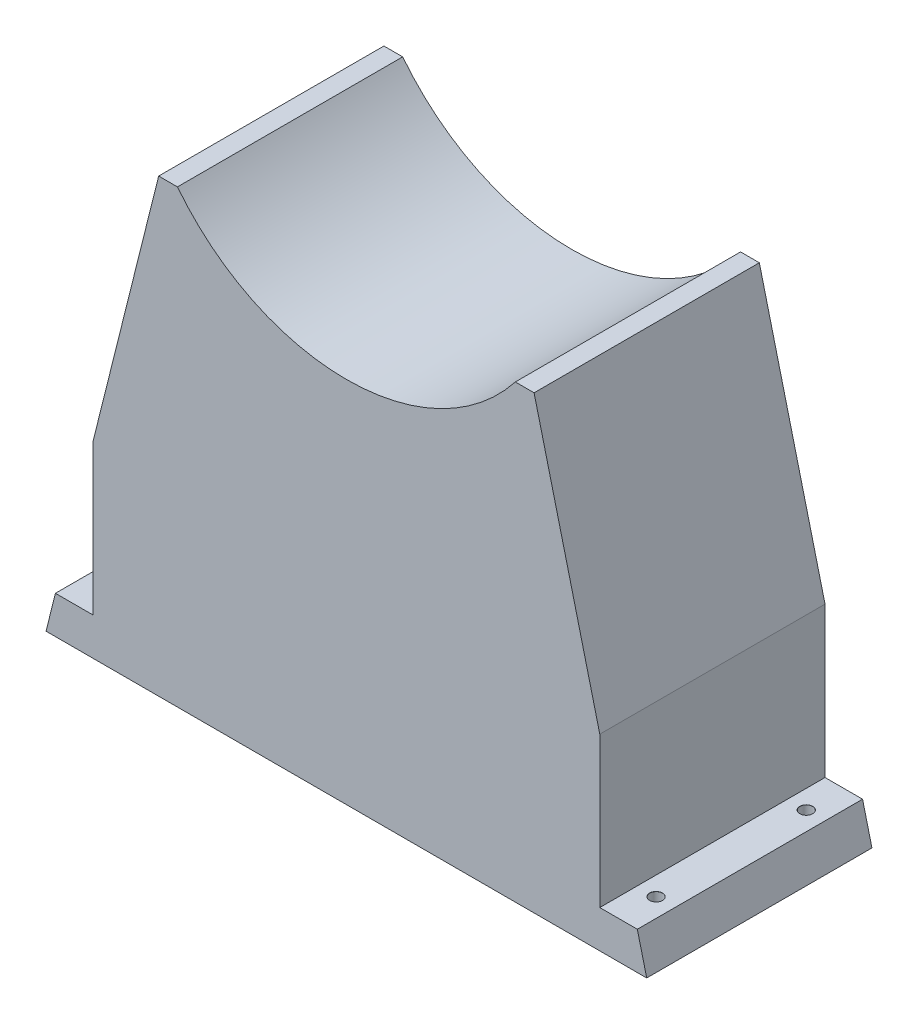
ISO-10303-21;
HEADER;
FILE_DESCRIPTION(('STEP AP214'),'2;1');
FILE_NAME('part.step','',(''),(''),'','','');
FILE_SCHEMA(('AUTOMOTIVE_DESIGN { 1 0 10303 214 1 1 1 1 }'));
ENDSEC;
DATA;
#1=APPLICATION_CONTEXT('core data for automotive mechanical design processes');
#2=APPLICATION_PROTOCOL_DEFINITION('international standard','automotive_design',2000,#1);
#3=PRODUCT_CONTEXT('',#1,'mechanical');
#4=PRODUCT('Part','Part','',(#3));
#5=PRODUCT_RELATED_PRODUCT_CATEGORY('part','',(#4));
#6=PRODUCT_DEFINITION_FORMATION('','',#4);
#7=PRODUCT_DEFINITION_CONTEXT('part definition',#1,'design');
#8=PRODUCT_DEFINITION('design','',#6,#7);
#9=PRODUCT_DEFINITION_SHAPE('','',#8);
#10=(LENGTH_UNIT() NAMED_UNIT(*) SI_UNIT(.MILLI.,.METRE.));
#11=(NAMED_UNIT(*) PLANE_ANGLE_UNIT() SI_UNIT($,.RADIAN.));
#12=(NAMED_UNIT(*) SI_UNIT($,.STERADIAN.) SOLID_ANGLE_UNIT());
#13=UNCERTAINTY_MEASURE_WITH_UNIT(LENGTH_MEASURE(1.E-05),#10,'distance_accuracy_value','');
#14=(GEOMETRIC_REPRESENTATION_CONTEXT(3) GLOBAL_UNCERTAINTY_ASSIGNED_CONTEXT((#13)) GLOBAL_UNIT_ASSIGNED_CONTEXT((#10,
#11,#12)) REPRESENTATION_CONTEXT('',''));
#15=CARTESIAN_POINT('',(0.,0.,0.));
#16=DIRECTION('',(0.,0.,1.));
#17=DIRECTION('',(1.,0.,0.));
#18=AXIS2_PLACEMENT_3D('',#15,#16,#17);
#19=CARTESIAN_POINT('',(152.5,9.99999999999995,50.));
#20=DIRECTION('',(0.,1.,0.));
#21=DIRECTION('',(0.,0.,1.));
#22=AXIS2_PLACEMENT_3D('',#19,#20,#21);
#23=CYLINDRICAL_SURFACE('',#22,1.69999999999998);
#24=CARTESIAN_POINT('',(152.5,9.97124078981942,50.));
#25=DIRECTION('',(0.,1.,0.));
#26=DIRECTION('',(0.,0.,1.));
#27=AXIS2_PLACEMENT_3D('',#24,#25,#26);
#28=CIRCLE('',#27,1.69999999999998);
#29=CARTESIAN_POINT('',(152.5,9.97124078981942,51.7));
#30=VERTEX_POINT('',#29);
#31=EDGE_CURVE('E241',#30,#30,#28,.T.);
#32=ORIENTED_EDGE('',*,*,#31,.T.);
#33=EDGE_LOOP('',(#32));
#34=FACE_BOUND('',#33,.T.);
#35=CARTESIAN_POINT('',(152.5,5.00000000000003,50.));
#36=DIRECTION('',(0.,-1.,0.));
#37=DIRECTION('',(1.,0.,0.));
#38=AXIS2_PLACEMENT_3D('',#35,#36,#37);
#39=CIRCLE('',#38,1.69999999999998);
#40=CARTESIAN_POINT('',(154.2,5.00000000000003,50.));
#41=VERTEX_POINT('',#40);
#42=EDGE_CURVE('E46',#41,#41,#39,.F.);
#43=ORIENTED_EDGE('',*,*,#42,.F.);
#44=EDGE_LOOP('',(#43));
#45=FACE_BOUND('',#44,.T.);
#46=ADVANCED_FACE('F42',(#34,#45),#23,.F.);
#47=CARTESIAN_POINT('',(152.5,9.99999999999995,10.));
#48=DIRECTION('',(0.,1.,0.));
#49=DIRECTION('',(0.,0.,1.));
#50=AXIS2_PLACEMENT_3D('',#47,#48,#49);
#51=CYLINDRICAL_SURFACE('',#50,1.69999999999998);
#52=CARTESIAN_POINT('',(152.5,9.97124078981942,10.));
#53=DIRECTION('',(0.,1.,0.));
#54=DIRECTION('',(0.,0.,1.));
#55=AXIS2_PLACEMENT_3D('',#52,#53,#54);
#56=CIRCLE('',#55,1.69999999999998);
#57=CARTESIAN_POINT('',(152.5,9.97124078981942,11.7));
#58=VERTEX_POINT('',#57);
#59=EDGE_CURVE('E233',#58,#58,#56,.T.);
#60=ORIENTED_EDGE('',*,*,#59,.T.);
#61=EDGE_LOOP('',(#60));
#62=FACE_BOUND('',#61,.T.);
#63=CARTESIAN_POINT('',(152.5,5.00000000000003,10.));
#64=DIRECTION('',(0.,-1.,0.));
#65=DIRECTION('',(1.,0.,0.));
#66=AXIS2_PLACEMENT_3D('',#63,#64,#65);
#67=CIRCLE('',#66,1.69999999999998);
#68=CARTESIAN_POINT('',(154.2,5.00000000000003,10.));
#69=VERTEX_POINT('',#68);
#70=EDGE_CURVE('E198',#69,#69,#67,.F.);
#71=ORIENTED_EDGE('',*,*,#70,.F.);
#72=EDGE_LOOP('',(#71));
#73=FACE_BOUND('',#72,.T.);
#74=ADVANCED_FACE('F363',(#62,#73),#51,.F.);
#75=CARTESIAN_POINT('',(7.5,10.,50.));
#76=DIRECTION('',(0.,1.,0.));
#77=DIRECTION('',(0.,0.,1.));
#78=AXIS2_PLACEMENT_3D('',#75,#76,#77);
#79=CYLINDRICAL_SURFACE('',#78,1.69999999999999);
#80=CARTESIAN_POINT('',(7.5,9.97124078981947,50.));
#81=DIRECTION('',(0.,1.,0.));
#82=DIRECTION('',(0.,0.,1.));
#83=AXIS2_PLACEMENT_3D('',#80,#81,#82);
#84=CIRCLE('',#83,1.69999999999999);
#85=CARTESIAN_POINT('',(7.5,9.97124078981947,51.7));
#86=VERTEX_POINT('',#85);
#87=EDGE_CURVE('E225',#86,#86,#84,.T.);
#88=ORIENTED_EDGE('',*,*,#87,.T.);
#89=EDGE_LOOP('',(#88));
#90=FACE_BOUND('',#89,.T.);
#91=CARTESIAN_POINT('',(7.5,5.,50.));
#92=DIRECTION('',(0.,-1.,0.));
#93=DIRECTION('',(1.,0.,0.));
#94=AXIS2_PLACEMENT_3D('',#91,#92,#93);
#95=CIRCLE('',#94,1.69999999999999);
#96=CARTESIAN_POINT('',(9.19999999999999,5.,50.));
#97=VERTEX_POINT('',#96);
#98=EDGE_CURVE('E194',#97,#97,#95,.F.);
#99=ORIENTED_EDGE('',*,*,#98,.F.);
#100=EDGE_LOOP('',(#99));
#101=FACE_BOUND('',#100,.T.);
#102=ADVANCED_FACE('F370',(#90,#101),#79,.F.);
#103=CARTESIAN_POINT('',(7.5,10.,10.));
#104=DIRECTION('',(0.,1.,0.));
#105=DIRECTION('',(0.,0.,1.));
#106=AXIS2_PLACEMENT_3D('',#103,#104,#105);
#107=CYLINDRICAL_SURFACE('',#106,1.69999999999999);
#108=CARTESIAN_POINT('',(7.5,9.97124078981947,10.));
#109=DIRECTION('',(0.,1.,0.));
#110=DIRECTION('',(0.,0.,1.));
#111=AXIS2_PLACEMENT_3D('',#108,#109,#110);
#112=CIRCLE('',#111,1.69999999999999);
#113=CARTESIAN_POINT('',(7.5,9.97124078981947,11.7));
#114=VERTEX_POINT('',#113);
#115=EDGE_CURVE('E210',#114,#114,#112,.T.);
#116=ORIENTED_EDGE('',*,*,#115,.T.);
#117=EDGE_LOOP('',(#116));
#118=FACE_BOUND('',#117,.T.);
#119=CARTESIAN_POINT('',(7.5,5.,10.));
#120=DIRECTION('',(0.,-1.,0.));
#121=DIRECTION('',(1.,0.,0.));
#122=AXIS2_PLACEMENT_3D('',#119,#120,#121);
#123=CIRCLE('',#122,1.69999999999999);
#124=CARTESIAN_POINT('',(9.19999999999999,5.,10.));
#125=VERTEX_POINT('',#124);
#126=EDGE_CURVE('E190',#125,#125,#123,.F.);
#127=ORIENTED_EDGE('',*,*,#126,.F.);
#128=EDGE_LOOP('',(#127));
#129=FACE_BOUND('',#128,.T.);
#130=ADVANCED_FACE('F444',(#118,#129),#107,.F.);
#131=CARTESIAN_POINT('',(130.,120.,60.));
#132=DIRECTION('',(-0.970142500145332,-0.242535625036333,0.));
#133=DIRECTION('',(0.242535625036333,-0.970142500145332,0.));
#134=AXIS2_PLACEMENT_3D('',#131,#132,#133);
#135=PLANE('',#134);
#136=DIRECTION('',(-0.242535625036333,0.970142500145332,0.));
#137=VECTOR('',#136,1.);
#138=CARTESIAN_POINT('',(130.,120.,0.));
#139=LINE('',#138,#137);
#140=CARTESIAN_POINT('',(160.,0.,0.));
#141=VERTEX_POINT('',#140);
#142=CARTESIAN_POINT('',(157.5,10.0000000000001,0.));
#143=VERTEX_POINT('',#142);
#144=EDGE_CURVE('E302',#141,#143,#139,.T.);
#145=ORIENTED_EDGE('',*,*,#144,.T.);
#146=DIRECTION('',(0.,0.,1.));
#147=VECTOR('',#146,1.);
#148=CARTESIAN_POINT('',(157.5,10.0000000000001,-0.001000000000001));
#149=LINE('',#148,#147);
#150=CARTESIAN_POINT('',(157.5,10.0000000000001,60.));
#151=VERTEX_POINT('',#150);
#152=EDGE_CURVE('E260',#143,#151,#149,.T.);
#153=ORIENTED_EDGE('',*,*,#152,.T.);
#154=DIRECTION('',(-0.242535625036333,0.970142500145332,0.));
#155=VECTOR('',#154,1.);
#156=CARTESIAN_POINT('',(130.,120.,60.));
#157=LINE('',#156,#155);
#158=CARTESIAN_POINT('',(160.,0.,60.));
#159=VERTEX_POINT('',#158);
#160=EDGE_CURVE('E283',#159,#151,#157,.T.);
#161=ORIENTED_EDGE('',*,*,#160,.F.);
#162=DIRECTION('',(0.,0.,-1.));
#163=VECTOR('',#162,1.);
#164=CARTESIAN_POINT('',(160.,0.,60.));
#165=LINE('',#164,#163);
#166=EDGE_CURVE('E11',#159,#141,#165,.T.);
#167=ORIENTED_EDGE('',*,*,#166,.T.);
#168=EDGE_LOOP('',(#145,#153,#161,#167));
#169=FACE_BOUND('',#168,.T.);
#170=ADVANCED_FACE('F345',(#169),#135,.F.);
#171=CARTESIAN_POINT('',(0.,0.,60.));
#172=DIRECTION('',(0.970142500145332,-0.242535625036333,0.));
#173=DIRECTION('',(0.242535625036333,0.970142500145332,0.));
#174=AXIS2_PLACEMENT_3D('',#171,#172,#173);
#175=PLANE('',#174);
#176=DIRECTION('',(-0.242535625036333,-0.970142500145332,0.));
#177=VECTOR('',#176,1.);
#178=CARTESIAN_POINT('',(0.,0.,0.));
#179=LINE('',#178,#177);
#180=CARTESIAN_POINT('',(30.,120.,0.));
#181=VERTEX_POINT('',#180);
#182=CARTESIAN_POINT('',(12.5,50.,0.));
#183=VERTEX_POINT('',#182);
#184=EDGE_CURVE('E160',#181,#183,#179,.T.);
#185=ORIENTED_EDGE('',*,*,#184,.T.);
#186=DIRECTION('',(0.,0.,1.));
#187=VECTOR('',#186,1.);
#188=CARTESIAN_POINT('',(12.5,50.,-0.001000000000001));
#189=LINE('',#188,#187);
#190=CARTESIAN_POINT('',(12.5,50.,60.));
#191=VERTEX_POINT('',#190);
#192=EDGE_CURVE('E144',#183,#191,#189,.T.);
#193=ORIENTED_EDGE('',*,*,#192,.T.);
#194=DIRECTION('',(-0.242535625036333,-0.970142500145332,0.));
#195=VECTOR('',#194,1.);
#196=CARTESIAN_POINT('',(0.,0.,60.));
#197=LINE('',#196,#195);
#198=CARTESIAN_POINT('',(30.,120.,60.));
#199=VERTEX_POINT('',#198);
#200=EDGE_CURVE('E175',#199,#191,#197,.T.);
#201=ORIENTED_EDGE('',*,*,#200,.F.);
#202=DIRECTION('',(0.,0.,-1.));
#203=VECTOR('',#202,1.);
#204=CARTESIAN_POINT('',(30.,120.,60.));
#205=LINE('',#204,#203);
#206=EDGE_CURVE('E174',#199,#181,#205,.T.);
#207=ORIENTED_EDGE('',*,*,#206,.T.);
#208=EDGE_LOOP('',(#185,#193,#201,#207));
#209=FACE_BOUND('',#208,.T.);
#210=ADVANCED_FACE('F323',(#209),#175,.F.);
#211=CARTESIAN_POINT('',(160.,0.,60.));
#212=DIRECTION('',(0.,1.,0.));
#213=DIRECTION('',(-1.,0.,0.));
#214=AXIS2_PLACEMENT_3D('',#211,#212,#213);
#215=PLANE('',#214);
#216=CARTESIAN_POINT('',(152.5,0.,50.));
#217=DIRECTION('',(0.,-1.,0.));
#218=DIRECTION('',(1.,0.,0.));
#219=AXIS2_PLACEMENT_3D('',#216,#217,#218);
#220=CIRCLE('',#219,3.25000000000001);
#221=CARTESIAN_POINT('',(155.75,0.,50.));
#222=VERTEX_POINT('',#221);
#223=EDGE_CURVE('E661',#222,#222,#220,.T.);
#224=ORIENTED_EDGE('',*,*,#223,.F.);
#225=EDGE_LOOP('',(#224));
#226=FACE_BOUND('',#225,.T.);
#227=CARTESIAN_POINT('',(152.5,0.,10.));
#228=DIRECTION('',(0.,-1.,0.));
#229=DIRECTION('',(1.,0.,0.));
#230=AXIS2_PLACEMENT_3D('',#227,#228,#229);
#231=CIRCLE('',#230,3.25000000000001);
#232=CARTESIAN_POINT('',(155.75,0.,10.));
#233=VERTEX_POINT('',#232);
#234=EDGE_CURVE('E668',#233,#233,#231,.T.);
#235=ORIENTED_EDGE('',*,*,#234,.F.);
#236=EDGE_LOOP('',(#235));
#237=FACE_BOUND('',#236,.T.);
#238=CARTESIAN_POINT('',(7.5,0.,10.));
#239=DIRECTION('',(0.,-1.,0.));
#240=DIRECTION('',(1.,0.,0.));
#241=AXIS2_PLACEMENT_3D('',#238,#239,#240);
#242=CIRCLE('',#241,3.25);
#243=CARTESIAN_POINT('',(10.75,0.,10.));
#244=VERTEX_POINT('',#243);
#245=EDGE_CURVE('E677',#244,#244,#242,.T.);
#246=ORIENTED_EDGE('',*,*,#245,.F.);
#247=EDGE_LOOP('',(#246));
#248=FACE_BOUND('',#247,.T.);
#249=CARTESIAN_POINT('',(7.5,0.,50.));
#250=DIRECTION('',(0.,-1.,0.));
#251=DIRECTION('',(1.,0.,0.));
#252=AXIS2_PLACEMENT_3D('',#249,#250,#251);
#253=CIRCLE('',#252,3.25);
#254=CARTESIAN_POINT('',(10.75,0.,50.));
#255=VERTEX_POINT('',#254);
#256=EDGE_CURVE('E219',#255,#255,#253,.T.);
#257=ORIENTED_EDGE('',*,*,#256,.F.);
#258=EDGE_LOOP('',(#257));
#259=FACE_BOUND('',#258,.T.);
#260=DIRECTION('',(1.,0.,0.));
#261=VECTOR('',#260,1.);
#262=CARTESIAN_POINT('',(160.,0.,0.));
#263=LINE('',#262,#261);
#264=CARTESIAN_POINT('',(0.,0.,0.));
#265=VERTEX_POINT('',#264);
#266=EDGE_CURVE('E143',#265,#141,#263,.T.);
#267=ORIENTED_EDGE('',*,*,#266,.T.);
#268=ORIENTED_EDGE('',*,*,#166,.F.);
#269=DIRECTION('',(1.,0.,0.));
#270=VECTOR('',#269,1.);
#271=CARTESIAN_POINT('',(160.,0.,60.));
#272=LINE('',#271,#270);
#273=CARTESIAN_POINT('',(0.,0.,60.));
#274=VERTEX_POINT('',#273);
#275=EDGE_CURVE('E166',#274,#159,#272,.T.);
#276=ORIENTED_EDGE('',*,*,#275,.F.);
#277=DIRECTION('',(0.,0.,-1.));
#278=VECTOR('',#277,1.);
#279=CARTESIAN_POINT('',(0.,0.,60.));
#280=LINE('',#279,#278);
#281=EDGE_CURVE('E171',#274,#265,#280,.T.);
#282=ORIENTED_EDGE('',*,*,#281,.T.);
#283=EDGE_LOOP('',(#267,#268,#276,#282));
#284=FACE_BOUND('',#283,.T.);
#285=ADVANCED_FACE('F44',(#226,#237,#248,#259,#284),#215,.F.);
#286=CARTESIAN_POINT('',(147.5,50.0000000000001,60.));
#287=VERTEX_POINT('',#286);
#288=CARTESIAN_POINT('',(130.,120.,60.));
#289=VERTEX_POINT('',#288);
#290=EDGE_CURVE('E282',#287,#289,#157,.T.);
#291=ORIENTED_EDGE('',*,*,#290,.F.);
#292=DIRECTION('',(0.,0.,1.));
#293=VECTOR('',#292,1.);
#294=CARTESIAN_POINT('',(147.5,50.0000000000001,-0.001000000000001));
#295=LINE('',#294,#293);
#296=CARTESIAN_POINT('',(147.5,50.,0.));
#297=VERTEX_POINT('',#296);
#298=EDGE_CURVE('E261',#297,#287,#295,.T.);
#299=ORIENTED_EDGE('',*,*,#298,.F.);
#300=CARTESIAN_POINT('',(130.,120.,0.));
#301=VERTEX_POINT('',#300);
#302=EDGE_CURVE('E301',#297,#301,#139,.T.);
#303=ORIENTED_EDGE('',*,*,#302,.T.);
#304=DIRECTION('',(0.,0.,-1.));
#305=VECTOR('',#304,1.);
#306=CARTESIAN_POINT('',(130.,120.,60.));
#307=LINE('',#306,#305);
#308=EDGE_CURVE('E52',#289,#301,#307,.T.);
#309=ORIENTED_EDGE('',*,*,#308,.F.);
#310=EDGE_LOOP('',(#291,#299,#303,#309));
#311=FACE_BOUND('',#310,.T.);
#312=ADVANCED_FACE('F339',(#311),#135,.F.);
#313=CARTESIAN_POINT('',(125.,120.,60.));
#314=DIRECTION('',(0.,-1.,0.));
#315=DIRECTION('',(0.,0.,-1.));
#316=AXIS2_PLACEMENT_3D('',#313,#314,#315);
#317=PLANE('',#316);
#318=DIRECTION('',(-1.,0.,0.));
#319=VECTOR('',#318,1.);
#320=CARTESIAN_POINT('',(125.,120.,0.));
#321=LINE('',#320,#319);
#322=CARTESIAN_POINT('',(125.,120.,0.));
#323=VERTEX_POINT('',#322);
#324=EDGE_CURVE('E306',#301,#323,#321,.T.);
#325=ORIENTED_EDGE('',*,*,#324,.T.);
#326=DIRECTION('',(0.,0.,-1.));
#327=VECTOR('',#326,1.);
#328=CARTESIAN_POINT('',(125.,120.,60.));
#329=LINE('',#328,#327);
#330=CARTESIAN_POINT('',(125.,120.,60.));
#331=VERTEX_POINT('',#330);
#332=EDGE_CURVE('E183',#331,#323,#329,.T.);
#333=ORIENTED_EDGE('',*,*,#332,.F.);
#334=DIRECTION('',(-1.,0.,0.));
#335=VECTOR('',#334,1.);
#336=CARTESIAN_POINT('',(125.,120.,60.));
#337=LINE('',#336,#335);
#338=EDGE_CURVE('E287',#289,#331,#337,.T.);
#339=ORIENTED_EDGE('',*,*,#338,.F.);
#340=ORIENTED_EDGE('',*,*,#308,.T.);
#341=EDGE_LOOP('',(#325,#333,#339,#340));
#342=FACE_BOUND('',#341,.T.);
#343=ADVANCED_FACE('F333',(#342),#317,.F.);
#344=CARTESIAN_POINT('',(80.,155.22956854689,60.));
#345=DIRECTION('',(0.,0.,-1.));
#346=DIRECTION('',(-1.,0.,0.));
#347=AXIS2_PLACEMENT_3D('',#344,#345,#346);
#348=CYLINDRICAL_SURFACE('',#347,57.15);
#349=CARTESIAN_POINT('',(80.,155.22956854689,0.));
#350=DIRECTION('',(0.,0.,-1.));
#351=DIRECTION('',(1.,0.,0.));
#352=AXIS2_PLACEMENT_3D('',#349,#350,#351);
#353=CIRCLE('',#352,57.15);
#354=CARTESIAN_POINT('',(35.,120.,0.));
#355=VERTEX_POINT('',#354);
#356=EDGE_CURVE('E167',#323,#355,#353,.T.);
#357=ORIENTED_EDGE('',*,*,#356,.T.);
#358=DIRECTION('',(0.,0.,-1.));
#359=VECTOR('',#358,1.);
#360=CARTESIAN_POINT('',(35.,120.,60.));
#361=LINE('',#360,#359);
#362=CARTESIAN_POINT('',(35.,120.,60.));
#363=VERTEX_POINT('',#362);
#364=EDGE_CURVE('E179',#363,#355,#361,.T.);
#365=ORIENTED_EDGE('',*,*,#364,.F.);
#366=CARTESIAN_POINT('',(80.,155.22956854689,60.));
#367=DIRECTION('',(0.,0.,-1.));
#368=DIRECTION('',(1.,0.,0.));
#369=AXIS2_PLACEMENT_3D('',#366,#367,#368);
#370=CIRCLE('',#369,57.15);
#371=EDGE_CURVE('E290',#331,#363,#370,.T.);
#372=ORIENTED_EDGE('',*,*,#371,.F.);
#373=ORIENTED_EDGE('',*,*,#332,.T.);
#374=EDGE_LOOP('',(#357,#365,#372,#373));
#375=FACE_BOUND('',#374,.T.);
#376=ADVANCED_FACE('F312',(#375),#348,.F.);
#377=CARTESIAN_POINT('',(30.,120.,60.));
#378=DIRECTION('',(0.,-1.,0.));
#379=DIRECTION('',(0.,0.,-1.));
#380=AXIS2_PLACEMENT_3D('',#377,#378,#379);
#381=PLANE('',#380);
#382=DIRECTION('',(-1.,0.,0.));
#383=VECTOR('',#382,1.);
#384=CARTESIAN_POINT('',(30.,120.,0.));
#385=LINE('',#384,#383);
#386=EDGE_CURVE('E161',#355,#181,#385,.T.);
#387=ORIENTED_EDGE('',*,*,#386,.T.);
#388=ORIENTED_EDGE('',*,*,#206,.F.);
#389=DIRECTION('',(-1.,0.,0.));
#390=VECTOR('',#389,1.);
#391=CARTESIAN_POINT('',(30.,120.,60.));
#392=LINE('',#391,#390);
#393=EDGE_CURVE('E293',#363,#199,#392,.T.);
#394=ORIENTED_EDGE('',*,*,#393,.F.);
#395=ORIENTED_EDGE('',*,*,#364,.T.);
#396=EDGE_LOOP('',(#387,#388,#394,#395));
#397=FACE_BOUND('',#396,.T.);
#398=ADVANCED_FACE('F319',(#397),#381,.F.);
#399=CARTESIAN_POINT('',(2.5,10.,60.));
#400=VERTEX_POINT('',#399);
#401=EDGE_CURVE('E152',#400,#274,#197,.T.);
#402=ORIENTED_EDGE('',*,*,#401,.F.);
#403=DIRECTION('',(0.,0.,1.));
#404=VECTOR('',#403,1.);
#405=CARTESIAN_POINT('',(2.5,10.,-0.001000000000001));
#406=LINE('',#405,#404);
#407=CARTESIAN_POINT('',(2.5,10.,0.));
#408=VERTEX_POINT('',#407);
#409=EDGE_CURVE('E137',#408,#400,#406,.T.);
#410=ORIENTED_EDGE('',*,*,#409,.F.);
#411=EDGE_CURVE('E150',#408,#265,#179,.T.);
#412=ORIENTED_EDGE('',*,*,#411,.T.);
#413=ORIENTED_EDGE('',*,*,#281,.F.);
#414=EDGE_LOOP('',(#402,#410,#412,#413));
#415=FACE_BOUND('',#414,.T.);
#416=ADVANCED_FACE('F148',(#415),#175,.F.);
#417=CARTESIAN_POINT('',(80.,155.22956854689,60.));
#418=DIRECTION('',(0.,0.,1.));
#419=DIRECTION('',(1.,0.,0.));
#420=AXIS2_PLACEMENT_3D('',#417,#418,#419);
#421=PLANE('',#420);
#422=DIRECTION('',(0.,1.,0.));
#423=VECTOR('',#422,1.);
#424=CARTESIAN_POINT('',(12.5,10.,60.));
#425=LINE('',#424,#423);
#426=CARTESIAN_POINT('',(12.5,10.,60.));
#427=VERTEX_POINT('',#426);
#428=EDGE_CURVE('E154',#427,#191,#425,.T.);
#429=ORIENTED_EDGE('',*,*,#428,.F.);
#430=DIRECTION('',(1.,0.,0.));
#431=VECTOR('',#430,1.);
#432=CARTESIAN_POINT('',(2.5,10.,60.));
#433=LINE('',#432,#431);
#434=EDGE_CURVE('E248',#400,#427,#433,.T.);
#435=ORIENTED_EDGE('',*,*,#434,.F.);
#436=ORIENTED_EDGE('',*,*,#401,.T.);
#437=ORIENTED_EDGE('',*,*,#275,.T.);
#438=ORIENTED_EDGE('',*,*,#160,.T.);
#439=DIRECTION('',(1.,0.,0.));
#440=VECTOR('',#439,1.);
#441=CARTESIAN_POINT('',(157.5,10.0000000000001,60.));
#442=LINE('',#441,#440);
#443=CARTESIAN_POINT('',(147.5,10.0000000000001,60.));
#444=VERTEX_POINT('',#443);
#445=EDGE_CURVE('E264',#444,#151,#442,.T.);
#446=ORIENTED_EDGE('',*,*,#445,.F.);
#447=DIRECTION('',(0.,-1.,0.));
#448=VECTOR('',#447,1.);
#449=CARTESIAN_POINT('',(147.5,10.0000000000001,60.));
#450=LINE('',#449,#448);
#451=EDGE_CURVE('E273',#287,#444,#450,.T.);
#452=ORIENTED_EDGE('',*,*,#451,.F.);
#453=ORIENTED_EDGE('',*,*,#290,.T.);
#454=ORIENTED_EDGE('',*,*,#338,.T.);
#455=ORIENTED_EDGE('',*,*,#371,.T.);
#456=ORIENTED_EDGE('',*,*,#393,.T.);
#457=ORIENTED_EDGE('',*,*,#200,.T.);
#458=EDGE_LOOP('',(#429,#435,#436,#437,#438,#446,#452,#453,#454,#455,#456,#457));
#459=FACE_BOUND('',#458,.T.);
#460=ADVANCED_FACE('F327',(#459),#421,.T.);
#461=CARTESIAN_POINT('',(80.,155.22956854689,0.));
#462=DIRECTION('',(0.,0.,1.));
#463=DIRECTION('',(1.,0.,0.));
#464=AXIS2_PLACEMENT_3D('',#461,#462,#463);
#465=PLANE('',#464);
#466=DIRECTION('',(-1.,0.,0.));
#467=VECTOR('',#466,1.);
#468=CARTESIAN_POINT('',(2.5,10.,0.));
#469=LINE('',#468,#467);
#470=CARTESIAN_POINT('',(12.5,10.,0.));
#471=VERTEX_POINT('',#470);
#472=EDGE_CURVE('E133',#471,#408,#469,.T.);
#473=ORIENTED_EDGE('',*,*,#472,.F.);
#474=DIRECTION('',(0.,-1.,0.));
#475=VECTOR('',#474,1.);
#476=CARTESIAN_POINT('',(12.5,10.,0.));
#477=LINE('',#476,#475);
#478=EDGE_CURVE('E60',#183,#471,#477,.T.);
#479=ORIENTED_EDGE('',*,*,#478,.F.);
#480=ORIENTED_EDGE('',*,*,#184,.F.);
#481=ORIENTED_EDGE('',*,*,#386,.F.);
#482=ORIENTED_EDGE('',*,*,#356,.F.);
#483=ORIENTED_EDGE('',*,*,#324,.F.);
#484=ORIENTED_EDGE('',*,*,#302,.F.);
#485=DIRECTION('',(0.,1.,0.));
#486=VECTOR('',#485,1.);
#487=CARTESIAN_POINT('',(147.5,10.0000000000001,0.));
#488=LINE('',#487,#486);
#489=CARTESIAN_POINT('',(147.5,10.0000000000001,0.));
#490=VERTEX_POINT('',#489);
#491=EDGE_CURVE('E245',#490,#297,#488,.T.);
#492=ORIENTED_EDGE('',*,*,#491,.F.);
#493=DIRECTION('',(-1.,0.,0.));
#494=VECTOR('',#493,1.);
#495=CARTESIAN_POINT('',(157.5,10.0000000000001,0.));
#496=LINE('',#495,#494);
#497=EDGE_CURVE('E68',#143,#490,#496,.T.);
#498=ORIENTED_EDGE('',*,*,#497,.F.);
#499=ORIENTED_EDGE('',*,*,#144,.F.);
#500=ORIENTED_EDGE('',*,*,#266,.F.);
#501=ORIENTED_EDGE('',*,*,#411,.F.);
#502=EDGE_LOOP('',(#473,#479,#480,#481,#482,#483,#484,#492,#498,#499,#500,#501));
#503=FACE_BOUND('',#502,.T.);
#504=ADVANCED_FACE('F157',(#503),#465,.F.);
#505=CARTESIAN_POINT('',(157.5,10.0000000000001,-0.001000000000001));
#506=DIRECTION('',(0.,-1.,0.));
#507=DIRECTION('',(1.,0.,0.));
#508=AXIS2_PLACEMENT_3D('',#505,#506,#507);
#509=PLANE('',#508);
#510=CARTESIAN_POINT('',(152.5,9.99999999999995,10.));
#511=DIRECTION('',(0.,1.,0.));
#512=DIRECTION('',(0.,0.,1.));
#513=AXIS2_PLACEMENT_3D('',#510,#511,#512);
#514=CIRCLE('',#513,1.725);
#515=CARTESIAN_POINT('',(152.5,9.99999999999995,11.725));
#516=VERTEX_POINT('',#515);
#517=EDGE_CURVE('E229',#516,#516,#514,.T.);
#518=ORIENTED_EDGE('',*,*,#517,.F.);
#519=EDGE_LOOP('',(#518));
#520=FACE_BOUND('',#519,.T.);
#521=CARTESIAN_POINT('',(152.5,9.99999999999995,50.));
#522=DIRECTION('',(0.,1.,0.));
#523=DIRECTION('',(0.,0.,1.));
#524=AXIS2_PLACEMENT_3D('',#521,#522,#523);
#525=CIRCLE('',#524,1.725);
#526=CARTESIAN_POINT('',(152.5,9.99999999999995,51.725));
#527=VERTEX_POINT('',#526);
#528=EDGE_CURVE('E237',#527,#527,#525,.T.);
#529=ORIENTED_EDGE('',*,*,#528,.F.);
#530=EDGE_LOOP('',(#529));
#531=FACE_BOUND('',#530,.T.);
#532=ORIENTED_EDGE('',*,*,#497,.T.);
#533=DIRECTION('',(0.,0.,1.));
#534=VECTOR('',#533,1.);
#535=CARTESIAN_POINT('',(147.5,10.0000000000001,-0.001000000000001));
#536=LINE('',#535,#534);
#537=EDGE_CURVE('E265',#490,#444,#536,.T.);
#538=ORIENTED_EDGE('',*,*,#537,.T.);
#539=ORIENTED_EDGE('',*,*,#445,.T.);
#540=ORIENTED_EDGE('',*,*,#152,.F.);
#541=EDGE_LOOP('',(#532,#538,#539,#540));
#542=FACE_BOUND('',#541,.T.);
#543=ADVANCED_FACE('F343',(#520,#531,#542),#509,.F.);
#544=CARTESIAN_POINT('',(147.5,10.0000000000001,-0.001000000000001));
#545=DIRECTION('',(-1.,0.,0.));
#546=DIRECTION('',(0.,-1.,0.));
#547=AXIS2_PLACEMENT_3D('',#544,#545,#546);
#548=PLANE('',#547);
#549=ORIENTED_EDGE('',*,*,#491,.T.);
#550=ORIENTED_EDGE('',*,*,#298,.T.);
#551=ORIENTED_EDGE('',*,*,#451,.T.);
#552=ORIENTED_EDGE('',*,*,#537,.F.);
#553=EDGE_LOOP('',(#549,#550,#551,#552));
#554=FACE_BOUND('',#553,.T.);
#555=ADVANCED_FACE('F341',(#554),#548,.F.);
#556=CARTESIAN_POINT('',(12.5,10.,-0.001000000000001));
#557=DIRECTION('',(1.,0.,0.));
#558=DIRECTION('',(0.,0.,-1.));
#559=AXIS2_PLACEMENT_3D('',#556,#557,#558);
#560=PLANE('',#559);
#561=ORIENTED_EDGE('',*,*,#478,.T.);
#562=DIRECTION('',(0.,0.,1.));
#563=VECTOR('',#562,1.);
#564=CARTESIAN_POINT('',(12.5,10.,-0.001000000000001));
#565=LINE('',#564,#563);
#566=EDGE_CURVE('E139',#471,#427,#565,.T.);
#567=ORIENTED_EDGE('',*,*,#566,.T.);
#568=ORIENTED_EDGE('',*,*,#428,.T.);
#569=ORIENTED_EDGE('',*,*,#192,.F.);
#570=EDGE_LOOP('',(#561,#567,#568,#569));
#571=FACE_BOUND('',#570,.T.);
#572=ADVANCED_FACE('F377',(#571),#560,.F.);
#573=CARTESIAN_POINT('',(2.5,10.,-0.001000000000001));
#574=DIRECTION('',(0.,-1.,0.));
#575=DIRECTION('',(1.,0.,0.));
#576=AXIS2_PLACEMENT_3D('',#573,#574,#575);
#577=PLANE('',#576);
#578=CARTESIAN_POINT('',(7.5,10.,10.));
#579=DIRECTION('',(0.,1.,0.));
#580=DIRECTION('',(0.,0.,1.));
#581=AXIS2_PLACEMENT_3D('',#578,#579,#580);
#582=CIRCLE('',#581,1.725);
#583=CARTESIAN_POINT('',(7.5,10.,11.725));
#584=VERTEX_POINT('',#583);
#585=EDGE_CURVE('E205',#584,#584,#582,.T.);
#586=ORIENTED_EDGE('',*,*,#585,.F.);
#587=EDGE_LOOP('',(#586));
#588=FACE_BOUND('',#587,.T.);
#589=CARTESIAN_POINT('',(7.5,10.,50.));
#590=DIRECTION('',(0.,1.,0.));
#591=DIRECTION('',(0.,0.,1.));
#592=AXIS2_PLACEMENT_3D('',#589,#590,#591);
#593=CIRCLE('',#592,1.725);
#594=CARTESIAN_POINT('',(7.5,10.,51.725));
#595=VERTEX_POINT('',#594);
#596=EDGE_CURVE('E216',#595,#595,#593,.T.);
#597=ORIENTED_EDGE('',*,*,#596,.F.);
#598=EDGE_LOOP('',(#597));
#599=FACE_BOUND('',#598,.T.);
#600=ORIENTED_EDGE('',*,*,#472,.T.);
#601=ORIENTED_EDGE('',*,*,#409,.T.);
#602=ORIENTED_EDGE('',*,*,#434,.T.);
#603=ORIENTED_EDGE('',*,*,#566,.F.);
#604=EDGE_LOOP('',(#600,#601,#602,#603));
#605=FACE_BOUND('',#604,.T.);
#606=ADVANCED_FACE('F135',(#588,#599,#605),#577,.F.);
#607=CARTESIAN_POINT('',(152.5,9.99999999999995,50.));
#608=DIRECTION('',(0.,1.,0.));
#609=DIRECTION('',(0.,0.,1.));
#610=AXIS2_PLACEMENT_3D('',#607,#608,#609);
#611=CONICAL_SURFACE('',#610,1.725,0.715584993318076);
#612=ORIENTED_EDGE('',*,*,#31,.F.);
#613=EDGE_LOOP('',(#612));
#614=FACE_BOUND('',#613,.T.);
#615=ORIENTED_EDGE('',*,*,#528,.T.);
#616=EDGE_LOOP('',(#615));
#617=FACE_BOUND('',#616,.T.);
#618=ADVANCED_FACE('F376',(#614,#617),#611,.F.);
#619=CARTESIAN_POINT('',(152.5,9.99999999999995,10.));
#620=DIRECTION('',(0.,1.,0.));
#621=DIRECTION('',(0.,0.,1.));
#622=AXIS2_PLACEMENT_3D('',#619,#620,#621);
#623=CONICAL_SURFACE('',#622,1.725,0.715584993318076);
#624=ORIENTED_EDGE('',*,*,#59,.F.);
#625=EDGE_LOOP('',(#624));
#626=FACE_BOUND('',#625,.T.);
#627=ORIENTED_EDGE('',*,*,#517,.T.);
#628=EDGE_LOOP('',(#627));
#629=FACE_BOUND('',#628,.T.);
#630=ADVANCED_FACE('F483',(#626,#629),#623,.F.);
#631=CARTESIAN_POINT('',(7.5,10.,50.));
#632=DIRECTION('',(0.,1.,0.));
#633=DIRECTION('',(0.,0.,1.));
#634=AXIS2_PLACEMENT_3D('',#631,#632,#633);
#635=CONICAL_SURFACE('',#634,1.725,0.715584993317767);
#636=ORIENTED_EDGE('',*,*,#87,.F.);
#637=EDGE_LOOP('',(#636));
#638=FACE_BOUND('',#637,.T.);
#639=ORIENTED_EDGE('',*,*,#596,.T.);
#640=EDGE_LOOP('',(#639));
#641=FACE_BOUND('',#640,.T.);
#642=ADVANCED_FACE('F493',(#638,#641),#635,.F.);
#643=CARTESIAN_POINT('',(7.5,10.,10.));
#644=DIRECTION('',(0.,1.,0.));
#645=DIRECTION('',(0.,0.,1.));
#646=AXIS2_PLACEMENT_3D('',#643,#644,#645);
#647=CONICAL_SURFACE('',#646,1.725,0.715584993317767);
#648=ORIENTED_EDGE('',*,*,#115,.F.);
#649=EDGE_LOOP('',(#648));
#650=FACE_BOUND('',#649,.T.);
#651=ORIENTED_EDGE('',*,*,#585,.T.);
#652=EDGE_LOOP('',(#651));
#653=FACE_BOUND('',#652,.T.);
#654=ADVANCED_FACE('F504',(#650,#653),#647,.F.);
#655=CARTESIAN_POINT('',(7.5,5.,10.));
#656=DIRECTION('',(0.,-1.,0.));
#657=DIRECTION('',(1.,0.,0.));
#658=AXIS2_PLACEMENT_3D('',#655,#656,#657);
#659=PLANE('',#658);
#660=CARTESIAN_POINT('',(7.5,5.,10.));
#661=DIRECTION('',(0.,-1.,0.));
#662=DIRECTION('',(1.,0.,0.));
#663=AXIS2_PLACEMENT_3D('',#660,#661,#662);
#664=CIRCLE('',#663,3.25);
#665=CARTESIAN_POINT('',(10.75,5.,10.));
#666=VERTEX_POINT('',#665);
#667=EDGE_CURVE('E682',#666,#666,#664,.T.);
#668=ORIENTED_EDGE('',*,*,#667,.T.);
#669=EDGE_LOOP('',(#668));
#670=FACE_BOUND('',#669,.T.);
#671=ORIENTED_EDGE('',*,*,#126,.T.);
#672=EDGE_LOOP('',(#671));
#673=FACE_BOUND('',#672,.T.);
#674=ADVANCED_FACE('F515',(#670,#673),#659,.T.);
#675=CARTESIAN_POINT('',(7.5,5.,10.));
#676=DIRECTION('',(0.,-1.,0.));
#677=DIRECTION('',(1.,0.,0.));
#678=AXIS2_PLACEMENT_3D('',#675,#676,#677);
#679=CYLINDRICAL_SURFACE('',#678,3.25);
#680=ORIENTED_EDGE('',*,*,#667,.F.);
#681=EDGE_LOOP('',(#680));
#682=FACE_BOUND('',#681,.T.);
#683=ORIENTED_EDGE('',*,*,#245,.T.);
#684=EDGE_LOOP('',(#683));
#685=FACE_BOUND('',#684,.T.);
#686=ADVANCED_FACE('F553',(#682,#685),#679,.F.);
#687=CARTESIAN_POINT('',(7.5,5.,50.));
#688=DIRECTION('',(0.,-1.,0.));
#689=DIRECTION('',(1.,0.,0.));
#690=AXIS2_PLACEMENT_3D('',#687,#688,#689);
#691=PLANE('',#690);
#692=CARTESIAN_POINT('',(7.5,5.,50.));
#693=DIRECTION('',(0.,-1.,0.));
#694=DIRECTION('',(1.,0.,0.));
#695=AXIS2_PLACEMENT_3D('',#692,#693,#694);
#696=CIRCLE('',#695,3.25);
#697=CARTESIAN_POINT('',(10.75,5.,50.));
#698=VERTEX_POINT('',#697);
#699=EDGE_CURVE('E195',#698,#698,#696,.T.);
#700=ORIENTED_EDGE('',*,*,#699,.T.);
#701=EDGE_LOOP('',(#700));
#702=FACE_BOUND('',#701,.T.);
#703=ORIENTED_EDGE('',*,*,#98,.T.);
#704=EDGE_LOOP('',(#703));
#705=FACE_BOUND('',#704,.T.);
#706=ADVANCED_FACE('F564',(#702,#705),#691,.T.);
#707=CARTESIAN_POINT('',(7.5,5.,50.));
#708=DIRECTION('',(0.,-1.,0.));
#709=DIRECTION('',(1.,0.,0.));
#710=AXIS2_PLACEMENT_3D('',#707,#708,#709);
#711=CYLINDRICAL_SURFACE('',#710,3.25);
#712=ORIENTED_EDGE('',*,*,#699,.F.);
#713=EDGE_LOOP('',(#712));
#714=FACE_BOUND('',#713,.T.);
#715=ORIENTED_EDGE('',*,*,#256,.T.);
#716=EDGE_LOOP('',(#715));
#717=FACE_BOUND('',#716,.T.);
#718=ADVANCED_FACE('F575',(#714,#717),#711,.F.);
#719=CARTESIAN_POINT('',(152.5,5.00000000000003,10.));
#720=DIRECTION('',(0.,-1.,0.));
#721=DIRECTION('',(1.,0.,0.));
#722=AXIS2_PLACEMENT_3D('',#719,#720,#721);
#723=PLANE('',#722);
#724=CARTESIAN_POINT('',(152.5,5.00000000000003,10.));
#725=DIRECTION('',(0.,-1.,0.));
#726=DIRECTION('',(1.,0.,0.));
#727=AXIS2_PLACEMENT_3D('',#724,#725,#726);
#728=CIRCLE('',#727,3.25000000000001);
#729=CARTESIAN_POINT('',(155.75,5.00000000000003,10.));
#730=VERTEX_POINT('',#729);
#731=EDGE_CURVE('E663',#730,#730,#728,.T.);
#732=ORIENTED_EDGE('',*,*,#731,.T.);
#733=EDGE_LOOP('',(#732));
#734=FACE_BOUND('',#733,.T.);
#735=ORIENTED_EDGE('',*,*,#70,.T.);
#736=EDGE_LOOP('',(#735));
#737=FACE_BOUND('',#736,.T.);
#738=ADVANCED_FACE('F586',(#734,#737),#723,.T.);
#739=CARTESIAN_POINT('',(152.5,5.00000000000003,10.));
#740=DIRECTION('',(0.,-1.,0.));
#741=DIRECTION('',(1.,0.,0.));
#742=AXIS2_PLACEMENT_3D('',#739,#740,#741);
#743=CYLINDRICAL_SURFACE('',#742,3.25000000000001);
#744=ORIENTED_EDGE('',*,*,#731,.F.);
#745=EDGE_LOOP('',(#744));
#746=FACE_BOUND('',#745,.T.);
#747=ORIENTED_EDGE('',*,*,#234,.T.);
#748=EDGE_LOOP('',(#747));
#749=FACE_BOUND('',#748,.T.);
#750=ADVANCED_FACE('F597',(#746,#749),#743,.F.);
#751=CARTESIAN_POINT('',(152.5,5.00000000000003,50.));
#752=DIRECTION('',(0.,-1.,0.));
#753=DIRECTION('',(1.,0.,0.));
#754=AXIS2_PLACEMENT_3D('',#751,#752,#753);
#755=PLANE('',#754);
#756=CARTESIAN_POINT('',(152.5,5.00000000000003,50.));
#757=DIRECTION('',(0.,-1.,0.));
#758=DIRECTION('',(1.,0.,0.));
#759=AXIS2_PLACEMENT_3D('',#756,#757,#758);
#760=CIRCLE('',#759,3.25000000000001);
#761=CARTESIAN_POINT('',(155.75,5.00000000000003,50.));
#762=VERTEX_POINT('',#761);
#763=EDGE_CURVE('E659',#762,#762,#760,.T.);
#764=ORIENTED_EDGE('',*,*,#763,.T.);
#765=EDGE_LOOP('',(#764));
#766=FACE_BOUND('',#765,.T.);
#767=ORIENTED_EDGE('',*,*,#42,.T.);
#768=EDGE_LOOP('',(#767));
#769=FACE_BOUND('',#768,.T.);
#770=ADVANCED_FACE('F608',(#766,#769),#755,.T.);
#771=CARTESIAN_POINT('',(152.5,5.00000000000003,50.));
#772=DIRECTION('',(0.,-1.,0.));
#773=DIRECTION('',(1.,0.,0.));
#774=AXIS2_PLACEMENT_3D('',#771,#772,#773);
#775=CYLINDRICAL_SURFACE('',#774,3.25000000000001);
#776=ORIENTED_EDGE('',*,*,#763,.F.);
#777=EDGE_LOOP('',(#776));
#778=FACE_BOUND('',#777,.T.);
#779=ORIENTED_EDGE('',*,*,#223,.T.);
#780=EDGE_LOOP('',(#779));
#781=FACE_BOUND('',#780,.T.);
#782=ADVANCED_FACE('F619',(#778,#781),#775,.F.);
#783=CLOSED_SHELL('',(#46,#74,#102,#130,#170,#210,#285,#312,#343,#376,#398,#416,#460,#504,#543,
#555,#572,#606,#618,#630,#642,#654,#674,#686,#706,#718,#738,#750,#770,#782));
#784=MANIFOLD_SOLID_BREP('B2',#783);
#785=ADVANCED_BREP_SHAPE_REPRESENTATION('',(#18,#784),#14);
#786=SHAPE_DEFINITION_REPRESENTATION(#9,#785);
ENDSEC;
END-ISO-10303-21;
